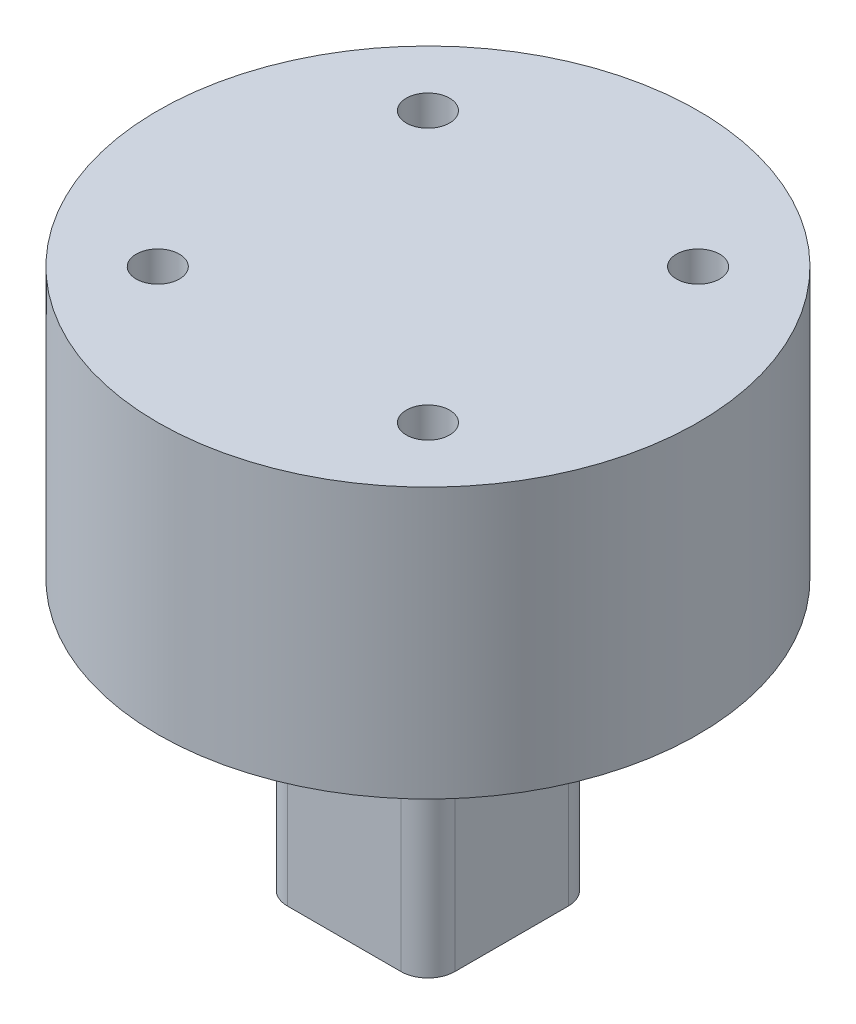
ISO-10303-21;
HEADER;
FILE_DESCRIPTION(('STEP AP214'),'2;1');
FILE_NAME('part.step','',(''),(''),'','','');
FILE_SCHEMA(('AUTOMOTIVE_DESIGN { 1 0 10303 214 1 1 1 1 }'));
ENDSEC;
DATA;
#1=APPLICATION_CONTEXT('core data for automotive mechanical design processes');
#2=APPLICATION_PROTOCOL_DEFINITION('international standard','automotive_design',2000,#1);
#3=PRODUCT_CONTEXT('',#1,'mechanical');
#4=PRODUCT('Part','Part','',(#3));
#5=PRODUCT_RELATED_PRODUCT_CATEGORY('part','',(#4));
#6=PRODUCT_DEFINITION_FORMATION('','',#4);
#7=PRODUCT_DEFINITION_CONTEXT('part definition',#1,'design');
#8=PRODUCT_DEFINITION('design','',#6,#7);
#9=PRODUCT_DEFINITION_SHAPE('','',#8);
#10=(LENGTH_UNIT() NAMED_UNIT(*) SI_UNIT(.MILLI.,.METRE.));
#11=(NAMED_UNIT(*) PLANE_ANGLE_UNIT() SI_UNIT($,.RADIAN.));
#12=(NAMED_UNIT(*) SI_UNIT($,.STERADIAN.) SOLID_ANGLE_UNIT());
#13=UNCERTAINTY_MEASURE_WITH_UNIT(LENGTH_MEASURE(1.E-05),#10,'distance_accuracy_value','');
#14=(GEOMETRIC_REPRESENTATION_CONTEXT(3) GLOBAL_UNCERTAINTY_ASSIGNED_CONTEXT((#13)) GLOBAL_UNIT_ASSIGNED_CONTEXT((#10,
#11,#12)) REPRESENTATION_CONTEXT('',''));
#15=CARTESIAN_POINT('',(0.,0.,0.));
#16=DIRECTION('',(0.,0.,1.));
#17=DIRECTION('',(1.,0.,0.));
#18=AXIS2_PLACEMENT_3D('',#15,#16,#17);
#19=CARTESIAN_POINT('',(0.,0.,0.));
#20=DIRECTION('',(0.,1.,0.));
#21=DIRECTION('',(0.,0.,1.));
#22=AXIS2_PLACEMENT_3D('',#19,#20,#21);
#23=PLANE('',#22);
#24=CARTESIAN_POINT('',(0.,0.,0.));
#25=DIRECTION('',(0.,1.,0.));
#26=DIRECTION('',(0.,0.,1.));
#27=AXIS2_PLACEMENT_3D('',#24,#25,#26);
#28=CIRCLE('',#27,10.);
#29=CARTESIAN_POINT('',(0.,0.,10.));
#30=VERTEX_POINT('',#29);
#31=EDGE_CURVE('E45',#30,#30,#28,.T.);
#32=ORIENTED_EDGE('',*,*,#31,.F.);
#33=EDGE_LOOP('',(#32));
#34=FACE_BOUND('',#33,.T.);
#35=CARTESIAN_POINT('',(-5.,0.,5.));
#36=DIRECTION('',(0.,1.,0.));
#37=DIRECTION('',(0.,0.,1.));
#38=AXIS2_PLACEMENT_3D('',#35,#36,#37);
#39=CIRCLE('',#38,0.799999999999999);
#40=CARTESIAN_POINT('',(-5.,0.,5.8));
#41=VERTEX_POINT('',#40);
#42=EDGE_CURVE('E153',#41,#41,#39,.T.);
#43=ORIENTED_EDGE('',*,*,#42,.T.);
#44=EDGE_LOOP('',(#43));
#45=FACE_BOUND('',#44,.T.);
#46=CARTESIAN_POINT('',(5.,0.,5.));
#47=DIRECTION('',(0.,1.,0.));
#48=DIRECTION('',(0.,0.,1.));
#49=AXIS2_PLACEMENT_3D('',#46,#47,#48);
#50=CIRCLE('',#49,0.799999999999999);
#51=CARTESIAN_POINT('',(5.,0.,5.8));
#52=VERTEX_POINT('',#51);
#53=EDGE_CURVE('E147',#52,#52,#50,.T.);
#54=ORIENTED_EDGE('',*,*,#53,.T.);
#55=EDGE_LOOP('',(#54));
#56=FACE_BOUND('',#55,.T.);
#57=CARTESIAN_POINT('',(5.,0.,-5.));
#58=DIRECTION('',(0.,1.,0.));
#59=DIRECTION('',(0.,0.,1.));
#60=AXIS2_PLACEMENT_3D('',#57,#58,#59);
#61=CIRCLE('',#60,0.799999999999999);
#62=CARTESIAN_POINT('',(5.,0.,-4.2));
#63=VERTEX_POINT('',#62);
#64=EDGE_CURVE('E141',#63,#63,#61,.T.);
#65=ORIENTED_EDGE('',*,*,#64,.T.);
#66=EDGE_LOOP('',(#65));
#67=FACE_BOUND('',#66,.T.);
#68=CARTESIAN_POINT('',(-5.,0.,-5.));
#69=DIRECTION('',(0.,1.,0.));
#70=DIRECTION('',(0.,0.,1.));
#71=AXIS2_PLACEMENT_3D('',#68,#69,#70);
#72=CIRCLE('',#71,0.799999999999999);
#73=CARTESIAN_POINT('',(-5.,0.,-4.2));
#74=VERTEX_POINT('',#73);
#75=EDGE_CURVE('E130',#74,#74,#72,.T.);
#76=ORIENTED_EDGE('',*,*,#75,.T.);
#77=EDGE_LOOP('',(#76));
#78=FACE_BOUND('',#77,.T.);
#79=CARTESIAN_POINT('',(-2.1,0.,-2.1));
#80=DIRECTION('',(0.,-1.,0.));
#81=DIRECTION('',(0.,0.,1.));
#82=AXIS2_PLACEMENT_3D('',#79,#80,#81);
#83=CIRCLE('',#82,1.);
#84=CARTESIAN_POINT('',(-3.1,0.,-2.1));
#85=VERTEX_POINT('',#84);
#86=CARTESIAN_POINT('',(-2.1,0.,-3.1));
#87=VERTEX_POINT('',#86);
#88=EDGE_CURVE('E126',#85,#87,#83,.T.);
#89=ORIENTED_EDGE('',*,*,#88,.F.);
#90=DIRECTION('',(0.,0.,-1.));
#91=VECTOR('',#90,1.);
#92=CARTESIAN_POINT('',(-3.1,0.,2.1));
#93=LINE('',#92,#91);
#94=CARTESIAN_POINT('',(-3.1,0.,2.1));
#95=VERTEX_POINT('',#94);
#96=EDGE_CURVE('E123',#95,#85,#93,.T.);
#97=ORIENTED_EDGE('',*,*,#96,.F.);
#98=CARTESIAN_POINT('',(-2.1,0.,2.1));
#99=DIRECTION('',(0.,-1.,0.));
#100=DIRECTION('',(0.,0.,1.));
#101=AXIS2_PLACEMENT_3D('',#98,#99,#100);
#102=CIRCLE('',#101,1.);
#103=CARTESIAN_POINT('',(-2.1,0.,3.1));
#104=VERTEX_POINT('',#103);
#105=EDGE_CURVE('E177',#104,#95,#102,.T.);
#106=ORIENTED_EDGE('',*,*,#105,.F.);
#107=DIRECTION('',(-1.,0.,0.));
#108=VECTOR('',#107,1.);
#109=CARTESIAN_POINT('',(-2.1,0.,3.1));
#110=LINE('',#109,#108);
#111=CARTESIAN_POINT('',(2.1,0.,3.1));
#112=VERTEX_POINT('',#111);
#113=EDGE_CURVE('E211',#112,#104,#110,.T.);
#114=ORIENTED_EDGE('',*,*,#113,.F.);
#115=CARTESIAN_POINT('',(2.1,0.,2.1));
#116=DIRECTION('',(0.,-1.,0.));
#117=DIRECTION('',(0.,0.,-1.));
#118=AXIS2_PLACEMENT_3D('',#115,#116,#117);
#119=CIRCLE('',#118,1.);
#120=CARTESIAN_POINT('',(3.1,0.,2.1));
#121=VERTEX_POINT('',#120);
#122=EDGE_CURVE('E205',#121,#112,#119,.T.);
#123=ORIENTED_EDGE('',*,*,#122,.F.);
#124=DIRECTION('',(0.,0.,1.));
#125=VECTOR('',#124,1.);
#126=CARTESIAN_POINT('',(3.1,0.,2.1));
#127=LINE('',#126,#125);
#128=CARTESIAN_POINT('',(3.1,0.,-2.1));
#129=VERTEX_POINT('',#128);
#130=EDGE_CURVE('E200',#129,#121,#127,.T.);
#131=ORIENTED_EDGE('',*,*,#130,.F.);
#132=CARTESIAN_POINT('',(2.1,0.,-2.1));
#133=DIRECTION('',(0.,-1.,0.));
#134=DIRECTION('',(0.,0.,1.));
#135=AXIS2_PLACEMENT_3D('',#132,#133,#134);
#136=CIRCLE('',#135,1.);
#137=CARTESIAN_POINT('',(2.1,0.,-3.1));
#138=VERTEX_POINT('',#137);
#139=EDGE_CURVE('E61',#138,#129,#136,.T.);
#140=ORIENTED_EDGE('',*,*,#139,.F.);
#141=DIRECTION('',(1.,0.,0.));
#142=VECTOR('',#141,1.);
#143=CARTESIAN_POINT('',(-2.1,0.,-3.1));
#144=LINE('',#143,#142);
#145=EDGE_CURVE('E56',#87,#138,#144,.T.);
#146=ORIENTED_EDGE('',*,*,#145,.F.);
#147=EDGE_LOOP('',(#89,#97,#106,#114,#123,#131,#140,#146));
#148=FACE_BOUND('',#147,.T.);
#149=ADVANCED_FACE('F41',(#34,#45,#56,#67,#78,#148),#23,.F.);
#150=CARTESIAN_POINT('',(0.,10.,0.));
#151=DIRECTION('',(0.,-1.,0.));
#152=DIRECTION('',(0.,0.,-1.));
#153=AXIS2_PLACEMENT_3D('',#150,#151,#152);
#154=CYLINDRICAL_SURFACE('',#153,10.);
#155=CARTESIAN_POINT('',(0.,10.,0.));
#156=DIRECTION('',(0.,1.,0.));
#157=DIRECTION('',(0.,0.,1.));
#158=AXIS2_PLACEMENT_3D('',#155,#156,#157);
#159=CIRCLE('',#158,10.);
#160=CARTESIAN_POINT('',(0.,10.,10.));
#161=VERTEX_POINT('',#160);
#162=EDGE_CURVE('E11',#161,#161,#159,.T.);
#163=ORIENTED_EDGE('',*,*,#162,.F.);
#164=EDGE_LOOP('',(#163));
#165=FACE_BOUND('',#164,.T.);
#166=ORIENTED_EDGE('',*,*,#31,.T.);
#167=EDGE_LOOP('',(#166));
#168=FACE_BOUND('',#167,.T.);
#169=ADVANCED_FACE('F43',(#165,#168),#154,.T.);
#170=CARTESIAN_POINT('',(0.,10.,0.));
#171=DIRECTION('',(0.,1.,0.));
#172=DIRECTION('',(0.,0.,1.));
#173=AXIS2_PLACEMENT_3D('',#170,#171,#172);
#174=PLANE('',#173);
#175=CARTESIAN_POINT('',(-5.,10.,-5.));
#176=DIRECTION('',(0.,1.,0.));
#177=DIRECTION('',(0.,0.,1.));
#178=AXIS2_PLACEMENT_3D('',#175,#176,#177);
#179=CIRCLE('',#178,0.8);
#180=CARTESIAN_POINT('',(-5.,10.,-4.2));
#181=VERTEX_POINT('',#180);
#182=EDGE_CURVE('E127',#181,#181,#179,.T.);
#183=ORIENTED_EDGE('',*,*,#182,.F.);
#184=EDGE_LOOP('',(#183));
#185=FACE_BOUND('',#184,.T.);
#186=CARTESIAN_POINT('',(5.,10.,-5.));
#187=DIRECTION('',(0.,1.,0.));
#188=DIRECTION('',(0.,0.,1.));
#189=AXIS2_PLACEMENT_3D('',#186,#187,#188);
#190=CIRCLE('',#189,0.8);
#191=CARTESIAN_POINT('',(5.,10.,-4.2));
#192=VERTEX_POINT('',#191);
#193=EDGE_CURVE('E138',#192,#192,#190,.T.);
#194=ORIENTED_EDGE('',*,*,#193,.F.);
#195=EDGE_LOOP('',(#194));
#196=FACE_BOUND('',#195,.T.);
#197=CARTESIAN_POINT('',(5.,10.,5.));
#198=DIRECTION('',(0.,1.,0.));
#199=DIRECTION('',(0.,0.,1.));
#200=AXIS2_PLACEMENT_3D('',#197,#198,#199);
#201=CIRCLE('',#200,0.8);
#202=CARTESIAN_POINT('',(5.,10.,5.8));
#203=VERTEX_POINT('',#202);
#204=EDGE_CURVE('E144',#203,#203,#201,.T.);
#205=ORIENTED_EDGE('',*,*,#204,.F.);
#206=EDGE_LOOP('',(#205));
#207=FACE_BOUND('',#206,.T.);
#208=CARTESIAN_POINT('',(-5.,10.,5.));
#209=DIRECTION('',(0.,1.,0.));
#210=DIRECTION('',(0.,0.,1.));
#211=AXIS2_PLACEMENT_3D('',#208,#209,#210);
#212=CIRCLE('',#211,0.799999999999999);
#213=CARTESIAN_POINT('',(-5.,10.,5.8));
#214=VERTEX_POINT('',#213);
#215=EDGE_CURVE('E150',#214,#214,#212,.T.);
#216=ORIENTED_EDGE('',*,*,#215,.F.);
#217=EDGE_LOOP('',(#216));
#218=FACE_BOUND('',#217,.T.);
#219=ORIENTED_EDGE('',*,*,#162,.T.);
#220=EDGE_LOOP('',(#219));
#221=FACE_BOUND('',#220,.T.);
#222=ADVANCED_FACE('F262',(#185,#196,#207,#218,#221),#174,.T.);
#223=CARTESIAN_POINT('',(-5.,10.,5.));
#224=DIRECTION('',(0.,1.,0.));
#225=DIRECTION('',(0.,0.,1.));
#226=AXIS2_PLACEMENT_3D('',#223,#224,#225);
#227=CYLINDRICAL_SURFACE('',#226,0.799999999999999);
#228=ORIENTED_EDGE('',*,*,#42,.F.);
#229=EDGE_LOOP('',(#228));
#230=FACE_BOUND('',#229,.T.);
#231=ORIENTED_EDGE('',*,*,#215,.T.);
#232=EDGE_LOOP('',(#231));
#233=FACE_BOUND('',#232,.T.);
#234=ADVANCED_FACE('F258',(#230,#233),#227,.F.);
#235=CARTESIAN_POINT('',(5.,10.,5.));
#236=DIRECTION('',(0.,1.,0.));
#237=DIRECTION('',(0.,0.,1.));
#238=AXIS2_PLACEMENT_3D('',#235,#236,#237);
#239=CYLINDRICAL_SURFACE('',#238,0.799999999999999);
#240=ORIENTED_EDGE('',*,*,#53,.F.);
#241=EDGE_LOOP('',(#240));
#242=FACE_BOUND('',#241,.T.);
#243=ORIENTED_EDGE('',*,*,#204,.T.);
#244=EDGE_LOOP('',(#243));
#245=FACE_BOUND('',#244,.T.);
#246=ADVANCED_FACE('F254',(#242,#245),#239,.F.);
#247=CARTESIAN_POINT('',(5.,10.,-5.));
#248=DIRECTION('',(0.,1.,0.));
#249=DIRECTION('',(0.,0.,1.));
#250=AXIS2_PLACEMENT_3D('',#247,#248,#249);
#251=CYLINDRICAL_SURFACE('',#250,0.799999999999999);
#252=ORIENTED_EDGE('',*,*,#64,.F.);
#253=EDGE_LOOP('',(#252));
#254=FACE_BOUND('',#253,.T.);
#255=ORIENTED_EDGE('',*,*,#193,.T.);
#256=EDGE_LOOP('',(#255));
#257=FACE_BOUND('',#256,.T.);
#258=ADVANCED_FACE('F250',(#254,#257),#251,.F.);
#259=CARTESIAN_POINT('',(-5.,10.,-5.));
#260=DIRECTION('',(0.,1.,0.));
#261=DIRECTION('',(0.,0.,1.));
#262=AXIS2_PLACEMENT_3D('',#259,#260,#261);
#263=CYLINDRICAL_SURFACE('',#262,0.799999999999999);
#264=ORIENTED_EDGE('',*,*,#75,.F.);
#265=EDGE_LOOP('',(#264));
#266=FACE_BOUND('',#265,.T.);
#267=ORIENTED_EDGE('',*,*,#182,.T.);
#268=EDGE_LOOP('',(#267));
#269=FACE_BOUND('',#268,.T.);
#270=ADVANCED_FACE('F247',(#266,#269),#263,.F.);
#271=CARTESIAN_POINT('',(-2.1,-10.,-2.1));
#272=DIRECTION('',(0.,1.,0.));
#273=DIRECTION('',(0.,0.,1.));
#274=AXIS2_PLACEMENT_3D('',#271,#272,#273);
#275=CYLINDRICAL_SURFACE('',#274,1.);
#276=ORIENTED_EDGE('',*,*,#88,.T.);
#277=DIRECTION('',(0.,1.,0.));
#278=VECTOR('',#277,1.);
#279=CARTESIAN_POINT('',(-2.1,-10.,-3.1));
#280=LINE('',#279,#278);
#281=CARTESIAN_POINT('',(-2.1,-10.,-3.1));
#282=VERTEX_POINT('',#281);
#283=EDGE_CURVE('E107',#282,#87,#280,.T.);
#284=ORIENTED_EDGE('',*,*,#283,.F.);
#285=CARTESIAN_POINT('',(-2.1,-10.,-2.1));
#286=DIRECTION('',(0.,-1.,0.));
#287=DIRECTION('',(0.,0.,1.));
#288=AXIS2_PLACEMENT_3D('',#285,#286,#287);
#289=CIRCLE('',#288,1.);
#290=CARTESIAN_POINT('',(-3.1,-10.,-2.1));
#291=VERTEX_POINT('',#290);
#292=EDGE_CURVE('E114',#291,#282,#289,.T.);
#293=ORIENTED_EDGE('',*,*,#292,.F.);
#294=DIRECTION('',(0.,1.,0.));
#295=VECTOR('',#294,1.);
#296=CARTESIAN_POINT('',(-3.1,-10.,-2.1));
#297=LINE('',#296,#295);
#298=EDGE_CURVE('E174',#291,#85,#297,.T.);
#299=ORIENTED_EDGE('',*,*,#298,.T.);
#300=EDGE_LOOP('',(#276,#284,#293,#299));
#301=FACE_BOUND('',#300,.T.);
#302=ADVANCED_FACE('F125',(#301),#275,.T.);
#303=CARTESIAN_POINT('',(-2.1,-10.,-3.1));
#304=DIRECTION('',(0.,0.,1.));
#305=DIRECTION('',(1.,0.,0.));
#306=AXIS2_PLACEMENT_3D('',#303,#304,#305);
#307=PLANE('',#306);
#308=ORIENTED_EDGE('',*,*,#145,.T.);
#309=DIRECTION('',(0.,1.,0.));
#310=VECTOR('',#309,1.);
#311=CARTESIAN_POINT('',(2.1,-10.,-3.1));
#312=LINE('',#311,#310);
#313=CARTESIAN_POINT('',(2.1,-10.,-3.1));
#314=VERTEX_POINT('',#313);
#315=EDGE_CURVE('E110',#314,#138,#312,.T.);
#316=ORIENTED_EDGE('',*,*,#315,.F.);
#317=DIRECTION('',(1.,0.,0.));
#318=VECTOR('',#317,1.);
#319=CARTESIAN_POINT('',(-2.1,-10.,-3.1));
#320=LINE('',#319,#318);
#321=EDGE_CURVE('E103',#282,#314,#320,.T.);
#322=ORIENTED_EDGE('',*,*,#321,.F.);
#323=ORIENTED_EDGE('',*,*,#283,.T.);
#324=EDGE_LOOP('',(#308,#316,#322,#323));
#325=FACE_BOUND('',#324,.T.);
#326=ADVANCED_FACE('F105',(#325),#307,.F.);
#327=CARTESIAN_POINT('',(2.1,-10.,-2.1));
#328=DIRECTION('',(0.,1.,0.));
#329=DIRECTION('',(0.,0.,1.));
#330=AXIS2_PLACEMENT_3D('',#327,#328,#329);
#331=CYLINDRICAL_SURFACE('',#330,1.);
#332=ORIENTED_EDGE('',*,*,#139,.T.);
#333=DIRECTION('',(0.,1.,0.));
#334=VECTOR('',#333,1.);
#335=CARTESIAN_POINT('',(3.1,-10.,-2.1));
#336=LINE('',#335,#334);
#337=CARTESIAN_POINT('',(3.1,-10.,-2.1));
#338=VERTEX_POINT('',#337);
#339=EDGE_CURVE('E132',#338,#129,#336,.T.);
#340=ORIENTED_EDGE('',*,*,#339,.F.);
#341=CARTESIAN_POINT('',(2.1,-10.,-2.1));
#342=DIRECTION('',(0.,-1.,0.));
#343=DIRECTION('',(0.,0.,1.));
#344=AXIS2_PLACEMENT_3D('',#341,#342,#343);
#345=CIRCLE('',#344,1.);
#346=EDGE_CURVE('E113',#314,#338,#345,.T.);
#347=ORIENTED_EDGE('',*,*,#346,.F.);
#348=ORIENTED_EDGE('',*,*,#315,.T.);
#349=EDGE_LOOP('',(#332,#340,#347,#348));
#350=FACE_BOUND('',#349,.T.);
#351=ADVANCED_FACE('F203',(#350),#331,.T.);
#352=CARTESIAN_POINT('',(3.1,-10.,2.1));
#353=DIRECTION('',(-1.,0.,0.));
#354=DIRECTION('',(0.,0.,1.));
#355=AXIS2_PLACEMENT_3D('',#352,#353,#354);
#356=PLANE('',#355);
#357=ORIENTED_EDGE('',*,*,#130,.T.);
#358=DIRECTION('',(0.,1.,0.));
#359=VECTOR('',#358,1.);
#360=CARTESIAN_POINT('',(3.1,-10.,2.1));
#361=LINE('',#360,#359);
#362=CARTESIAN_POINT('',(3.1,-10.,2.1));
#363=VERTEX_POINT('',#362);
#364=EDGE_CURVE('E191',#363,#121,#361,.T.);
#365=ORIENTED_EDGE('',*,*,#364,.F.);
#366=DIRECTION('',(0.,0.,1.));
#367=VECTOR('',#366,1.);
#368=CARTESIAN_POINT('',(3.1,-10.,2.1));
#369=LINE('',#368,#367);
#370=EDGE_CURVE('E201',#338,#363,#369,.T.);
#371=ORIENTED_EDGE('',*,*,#370,.F.);
#372=ORIENTED_EDGE('',*,*,#339,.T.);
#373=EDGE_LOOP('',(#357,#365,#371,#372));
#374=FACE_BOUND('',#373,.T.);
#375=ADVANCED_FACE('F198',(#374),#356,.F.);
#376=CARTESIAN_POINT('',(2.1,-10.,2.1));
#377=DIRECTION('',(0.,1.,0.));
#378=DIRECTION('',(0.,0.,1.));
#379=AXIS2_PLACEMENT_3D('',#376,#377,#378);
#380=CYLINDRICAL_SURFACE('',#379,1.);
#381=ORIENTED_EDGE('',*,*,#122,.T.);
#382=DIRECTION('',(0.,1.,0.));
#383=VECTOR('',#382,1.);
#384=CARTESIAN_POINT('',(2.1,-10.,3.1));
#385=LINE('',#384,#383);
#386=CARTESIAN_POINT('',(2.1,-10.,3.1));
#387=VERTEX_POINT('',#386);
#388=EDGE_CURVE('E188',#387,#112,#385,.T.);
#389=ORIENTED_EDGE('',*,*,#388,.F.);
#390=CARTESIAN_POINT('',(2.1,-10.,2.1));
#391=DIRECTION('',(0.,-1.,0.));
#392=DIRECTION('',(0.,0.,-1.));
#393=AXIS2_PLACEMENT_3D('',#390,#391,#392);
#394=CIRCLE('',#393,1.);
#395=EDGE_CURVE('E225',#363,#387,#394,.T.);
#396=ORIENTED_EDGE('',*,*,#395,.F.);
#397=ORIENTED_EDGE('',*,*,#364,.T.);
#398=EDGE_LOOP('',(#381,#389,#396,#397));
#399=FACE_BOUND('',#398,.T.);
#400=ADVANCED_FACE('F224',(#399),#380,.T.);
#401=CARTESIAN_POINT('',(-2.1,-10.,3.1));
#402=DIRECTION('',(0.,0.,-1.));
#403=DIRECTION('',(-1.,0.,0.));
#404=AXIS2_PLACEMENT_3D('',#401,#402,#403);
#405=PLANE('',#404);
#406=ORIENTED_EDGE('',*,*,#113,.T.);
#407=DIRECTION('',(0.,1.,0.));
#408=VECTOR('',#407,1.);
#409=CARTESIAN_POINT('',(-2.1,-10.,3.1));
#410=LINE('',#409,#408);
#411=CARTESIAN_POINT('',(-2.1,-10.,3.1));
#412=VERTEX_POINT('',#411);
#413=EDGE_CURVE('E180',#412,#104,#410,.T.);
#414=ORIENTED_EDGE('',*,*,#413,.F.);
#415=DIRECTION('',(-1.,0.,0.));
#416=VECTOR('',#415,1.);
#417=CARTESIAN_POINT('',(-2.1,-10.,3.1));
#418=LINE('',#417,#416);
#419=EDGE_CURVE('E221',#387,#412,#418,.T.);
#420=ORIENTED_EDGE('',*,*,#419,.F.);
#421=ORIENTED_EDGE('',*,*,#388,.T.);
#422=EDGE_LOOP('',(#406,#414,#420,#421));
#423=FACE_BOUND('',#422,.T.);
#424=ADVANCED_FACE('F218',(#423),#405,.F.);
#425=CARTESIAN_POINT('',(-2.1,-10.,2.1));
#426=DIRECTION('',(0.,1.,0.));
#427=DIRECTION('',(0.,0.,1.));
#428=AXIS2_PLACEMENT_3D('',#425,#426,#427);
#429=CYLINDRICAL_SURFACE('',#428,1.);
#430=ORIENTED_EDGE('',*,*,#105,.T.);
#431=DIRECTION('',(0.,1.,0.));
#432=VECTOR('',#431,1.);
#433=CARTESIAN_POINT('',(-3.1,-10.,2.1));
#434=LINE('',#433,#432);
#435=CARTESIAN_POINT('',(-3.1,-10.,2.1));
#436=VERTEX_POINT('',#435);
#437=EDGE_CURVE('E176',#436,#95,#434,.T.);
#438=ORIENTED_EDGE('',*,*,#437,.F.);
#439=CARTESIAN_POINT('',(-2.1,-10.,2.1));
#440=DIRECTION('',(0.,-1.,0.));
#441=DIRECTION('',(0.,0.,1.));
#442=AXIS2_PLACEMENT_3D('',#439,#440,#441);
#443=CIRCLE('',#442,1.);
#444=EDGE_CURVE('E182',#412,#436,#443,.T.);
#445=ORIENTED_EDGE('',*,*,#444,.F.);
#446=ORIENTED_EDGE('',*,*,#413,.T.);
#447=EDGE_LOOP('',(#430,#438,#445,#446));
#448=FACE_BOUND('',#447,.T.);
#449=ADVANCED_FACE('F214',(#448),#429,.T.);
#450=CARTESIAN_POINT('',(-3.1,-10.,2.1));
#451=DIRECTION('',(1.,0.,0.));
#452=DIRECTION('',(0.,0.,-1.));
#453=AXIS2_PLACEMENT_3D('',#450,#451,#452);
#454=PLANE('',#453);
#455=ORIENTED_EDGE('',*,*,#96,.T.);
#456=ORIENTED_EDGE('',*,*,#298,.F.);
#457=DIRECTION('',(0.,0.,-1.));
#458=VECTOR('',#457,1.);
#459=CARTESIAN_POINT('',(-3.1,-10.,2.1));
#460=LINE('',#459,#458);
#461=EDGE_CURVE('E119',#436,#291,#460,.T.);
#462=ORIENTED_EDGE('',*,*,#461,.F.);
#463=ORIENTED_EDGE('',*,*,#437,.T.);
#464=EDGE_LOOP('',(#455,#456,#462,#463));
#465=FACE_BOUND('',#464,.T.);
#466=ADVANCED_FACE('F173',(#465),#454,.F.);
#467=CARTESIAN_POINT('',(-2.1,-10.,-2.1));
#468=DIRECTION('',(0.,1.,0.));
#469=DIRECTION('',(0.,0.,1.));
#470=AXIS2_PLACEMENT_3D('',#467,#468,#469);
#471=PLANE('',#470);
#472=ORIENTED_EDGE('',*,*,#292,.T.);
#473=ORIENTED_EDGE('',*,*,#321,.T.);
#474=ORIENTED_EDGE('',*,*,#346,.T.);
#475=ORIENTED_EDGE('',*,*,#370,.T.);
#476=ORIENTED_EDGE('',*,*,#395,.T.);
#477=ORIENTED_EDGE('',*,*,#419,.T.);
#478=ORIENTED_EDGE('',*,*,#444,.T.);
#479=ORIENTED_EDGE('',*,*,#461,.T.);
#480=EDGE_LOOP('',(#472,#473,#474,#475,#476,#477,#478,#479));
#481=FACE_BOUND('',#480,.T.);
#482=ADVANCED_FACE('F117',(#481),#471,.F.);
#483=CLOSED_SHELL('',(#149,#169,#222,#234,#246,#258,#270,#302,#326,#351,#375,#400,#424,#449,
#466,#482));
#484=MANIFOLD_SOLID_BREP('B2',#483);
#485=ADVANCED_BREP_SHAPE_REPRESENTATION('',(#18,#484),#14);
#486=SHAPE_DEFINITION_REPRESENTATION(#9,#485);
ENDSEC;
END-ISO-10303-21;
